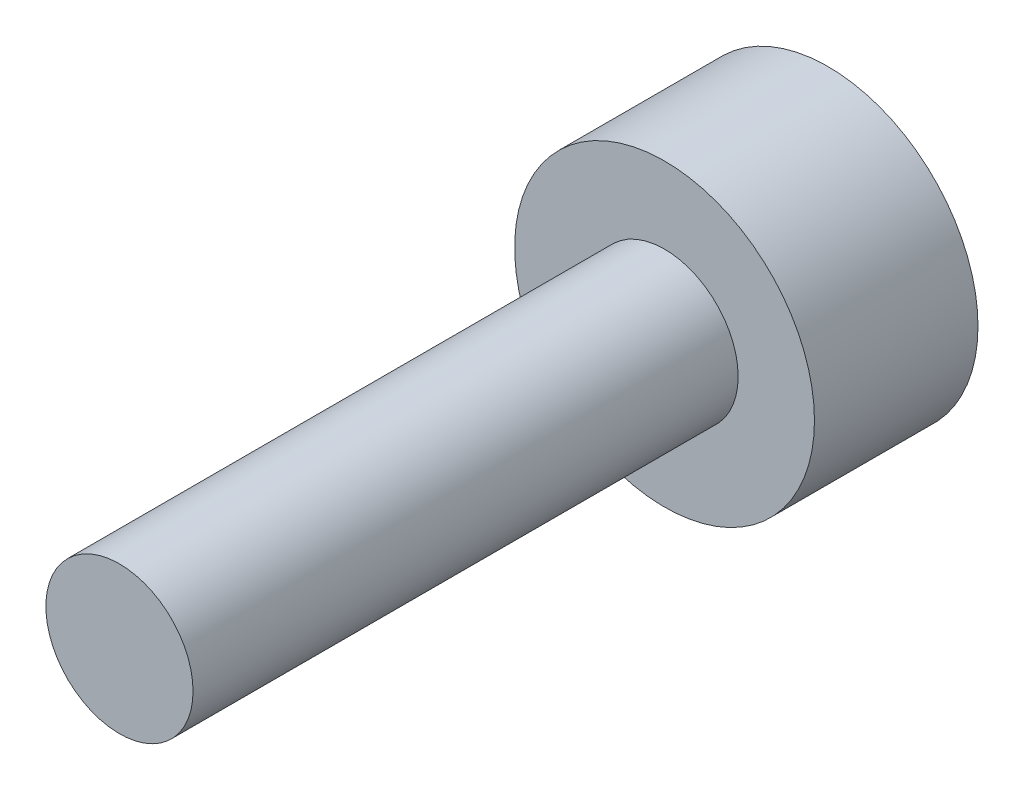
ISO-10303-21;
HEADER;
FILE_DESCRIPTION(('STEP AP214'),'2;1');
FILE_NAME('part.step','',(''),(''),'','','');
FILE_SCHEMA(('AUTOMOTIVE_DESIGN { 1 0 10303 214 1 1 1 1 }'));
ENDSEC;
DATA;
#1=APPLICATION_CONTEXT('core data for automotive mechanical design processes');
#2=APPLICATION_PROTOCOL_DEFINITION('international standard','automotive_design',2000,#1);
#3=PRODUCT_CONTEXT('',#1,'mechanical');
#4=PRODUCT('Part','Part','',(#3));
#5=PRODUCT_RELATED_PRODUCT_CATEGORY('part','',(#4));
#6=PRODUCT_DEFINITION_FORMATION('','',#4);
#7=PRODUCT_DEFINITION_CONTEXT('part definition',#1,'design');
#8=PRODUCT_DEFINITION('design','',#6,#7);
#9=PRODUCT_DEFINITION_SHAPE('','',#8);
#10=(LENGTH_UNIT() NAMED_UNIT(*) SI_UNIT(.MILLI.,.METRE.));
#11=(NAMED_UNIT(*) PLANE_ANGLE_UNIT() SI_UNIT($,.RADIAN.));
#12=(NAMED_UNIT(*) SI_UNIT($,.STERADIAN.) SOLID_ANGLE_UNIT());
#13=UNCERTAINTY_MEASURE_WITH_UNIT(LENGTH_MEASURE(1.E-05),#10,'distance_accuracy_value','');
#14=(GEOMETRIC_REPRESENTATION_CONTEXT(3) GLOBAL_UNCERTAINTY_ASSIGNED_CONTEXT((#13)) GLOBAL_UNIT_ASSIGNED_CONTEXT((#10,
#11,#12)) REPRESENTATION_CONTEXT('',''));
#15=CARTESIAN_POINT('',(0.,0.,0.));
#16=DIRECTION('',(0.,0.,1.));
#17=DIRECTION('',(1.,0.,0.));
#18=AXIS2_PLACEMENT_3D('',#15,#16,#17);
#19=CARTESIAN_POINT('',(0.,0.,10.));
#20=DIRECTION('',(0.,0.,1.));
#21=DIRECTION('',(1.,0.,0.));
#22=AXIS2_PLACEMENT_3D('',#19,#20,#21);
#23=PLANE('',#22);
#24=CARTESIAN_POINT('',(0.,0.,10.));
#25=DIRECTION('',(0.,0.,1.));
#26=DIRECTION('',(1.,0.,0.));
#27=AXIS2_PLACEMENT_3D('',#24,#25,#26);
#28=CIRCLE('',#27,1.35);
#29=CARTESIAN_POINT('',(1.35,0.,10.));
#30=VERTEX_POINT('',#29);
#31=EDGE_CURVE('E25',#30,#30,#28,.T.);
#32=ORIENTED_EDGE('',*,*,#31,.T.);
#33=EDGE_LOOP('',(#32));
#34=FACE_BOUND('',#33,.T.);
#35=ADVANCED_FACE('F17',(#34),#23,.T.);
#36=CARTESIAN_POINT('',(0.,0.,0.));
#37=DIRECTION('',(0.,0.,1.));
#38=DIRECTION('',(1.,0.,0.));
#39=AXIS2_PLACEMENT_3D('',#36,#37,#38);
#40=CYLINDRICAL_SURFACE('',#39,1.35);
#41=ORIENTED_EDGE('',*,*,#31,.F.);
#42=DIRECTION('',(0.,0.,1.));
#43=VECTOR('',#42,1.);
#44=CARTESIAN_POINT('',(1.35,0.,0.));
#45=LINE('',#44,#43);
#46=CARTESIAN_POINT('',(1.35,0.,0.));
#47=VERTEX_POINT('',#46);
#48=EDGE_CURVE('E11',#47,#30,#45,.T.);
#49=ORIENTED_EDGE('',*,*,#48,.F.);
#50=CARTESIAN_POINT('',(0.,0.,0.));
#51=DIRECTION('',(0.,0.,1.));
#52=DIRECTION('',(1.,0.,0.));
#53=AXIS2_PLACEMENT_3D('',#50,#51,#52);
#54=CIRCLE('',#53,1.35);
#55=EDGE_CURVE('E66',#47,#47,#54,.T.);
#56=ORIENTED_EDGE('',*,*,#55,.T.);
#57=ORIENTED_EDGE('',*,*,#48,.T.);
#58=EDGE_LOOP('',(#41,#49,#56,#57));
#59=FACE_BOUND('',#58,.T.);
#60=ADVANCED_FACE('F72',(#59),#40,.T.);
#61=CARTESIAN_POINT('',(0.,0.,-3.));
#62=DIRECTION('',(0.,0.,1.));
#63=DIRECTION('',(1.,0.,0.));
#64=AXIS2_PLACEMENT_3D('',#61,#62,#63);
#65=PLANE('',#64);
#66=CARTESIAN_POINT('',(0.,0.,-3.));
#67=DIRECTION('',(0.,0.,1.));
#68=DIRECTION('',(1.,0.,0.));
#69=AXIS2_PLACEMENT_3D('',#66,#67,#68);
#70=CIRCLE('',#69,2.75);
#71=CARTESIAN_POINT('',(2.75,0.,-3.));
#72=VERTEX_POINT('',#71);
#73=EDGE_CURVE('E56',#72,#72,#70,.T.);
#74=ORIENTED_EDGE('',*,*,#73,.F.);
#75=EDGE_LOOP('',(#74));
#76=FACE_BOUND('',#75,.T.);
#77=ADVANCED_FACE('F75',(#76),#65,.F.);
#78=CARTESIAN_POINT('',(0.,0.,0.));
#79=DIRECTION('',(0.,0.,1.));
#80=DIRECTION('',(1.,0.,0.));
#81=AXIS2_PLACEMENT_3D('',#78,#79,#80);
#82=PLANE('',#81);
#83=ORIENTED_EDGE('',*,*,#55,.F.);
#84=EDGE_LOOP('',(#83));
#85=FACE_BOUND('',#84,.T.);
#86=CARTESIAN_POINT('',(0.,0.,0.));
#87=DIRECTION('',(0.,0.,1.));
#88=DIRECTION('',(1.,0.,0.));
#89=AXIS2_PLACEMENT_3D('',#86,#87,#88);
#90=CIRCLE('',#89,2.75);
#91=CARTESIAN_POINT('',(2.75,0.,0.));
#92=VERTEX_POINT('',#91);
#93=EDGE_CURVE('E54',#92,#92,#90,.T.);
#94=ORIENTED_EDGE('',*,*,#93,.T.);
#95=EDGE_LOOP('',(#94));
#96=FACE_BOUND('',#95,.T.);
#97=ADVANCED_FACE('F60',(#85,#96),#82,.T.);
#98=CARTESIAN_POINT('',(0.,0.,-3.));
#99=DIRECTION('',(0.,0.,1.));
#100=DIRECTION('',(1.,0.,0.));
#101=AXIS2_PLACEMENT_3D('',#98,#99,#100);
#102=CYLINDRICAL_SURFACE('',#101,2.75);
#103=ORIENTED_EDGE('',*,*,#93,.F.);
#104=DIRECTION('',(0.,0.,1.));
#105=VECTOR('',#104,1.);
#106=CARTESIAN_POINT('',(2.75,0.,-3.));
#107=LINE('',#106,#105);
#108=EDGE_CURVE('E51',#72,#92,#107,.T.);
#109=ORIENTED_EDGE('',*,*,#108,.F.);
#110=ORIENTED_EDGE('',*,*,#73,.T.);
#111=ORIENTED_EDGE('',*,*,#108,.T.);
#112=EDGE_LOOP('',(#103,#109,#110,#111));
#113=FACE_BOUND('',#112,.T.);
#114=ADVANCED_FACE('F53',(#113),#102,.T.);
#115=CLOSED_SHELL('',(#35,#60,#77,#97,#114));
#116=MANIFOLD_SOLID_BREP('B1',#115);
#117=ADVANCED_BREP_SHAPE_REPRESENTATION('',(#18,#116),#14);
#118=SHAPE_DEFINITION_REPRESENTATION(#9,#117);
ENDSEC;
END-ISO-10303-21;
